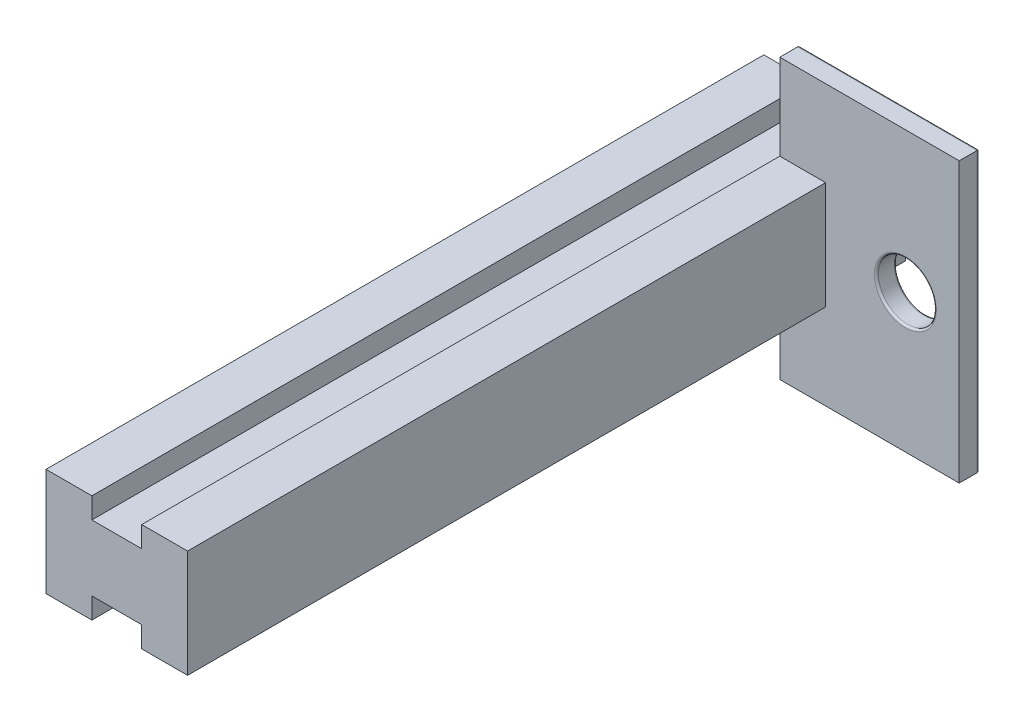
ISO-10303-21;
HEADER;
FILE_DESCRIPTION(('STEP AP214'),'2;1');
FILE_NAME('part.step','',(''),(''),'','','');
FILE_SCHEMA(('AUTOMOTIVE_DESIGN { 1 0 10303 214 1 1 1 1 }'));
ENDSEC;
DATA;
#1=APPLICATION_CONTEXT('core data for automotive mechanical design processes');
#2=APPLICATION_PROTOCOL_DEFINITION('international standard','automotive_design',2000,#1);
#3=PRODUCT_CONTEXT('',#1,'mechanical');
#4=PRODUCT('Part','Part','',(#3));
#5=PRODUCT_RELATED_PRODUCT_CATEGORY('part','',(#4));
#6=PRODUCT_DEFINITION_FORMATION('','',#4);
#7=PRODUCT_DEFINITION_CONTEXT('part definition',#1,'design');
#8=PRODUCT_DEFINITION('design','',#6,#7);
#9=PRODUCT_DEFINITION_SHAPE('','',#8);
#10=(LENGTH_UNIT() NAMED_UNIT(*) SI_UNIT(.MILLI.,.METRE.));
#11=(NAMED_UNIT(*) PLANE_ANGLE_UNIT() SI_UNIT($,.RADIAN.));
#12=(NAMED_UNIT(*) SI_UNIT($,.STERADIAN.) SOLID_ANGLE_UNIT());
#13=UNCERTAINTY_MEASURE_WITH_UNIT(LENGTH_MEASURE(1.E-05),#10,'distance_accuracy_value','');
#14=(GEOMETRIC_REPRESENTATION_CONTEXT(3) GLOBAL_UNCERTAINTY_ASSIGNED_CONTEXT((#13)) GLOBAL_UNIT_ASSIGNED_CONTEXT((#10,
#11,#12)) REPRESENTATION_CONTEXT('',''));
#15=CARTESIAN_POINT('',(0.,0.,0.));
#16=DIRECTION('',(0.,0.,1.));
#17=DIRECTION('',(1.,0.,0.));
#18=AXIS2_PLACEMENT_3D('',#15,#16,#17);
#19=CARTESIAN_POINT('',(1.19999999999997,-2.65,60.));
#20=DIRECTION('',(0.,1.,0.));
#21=DIRECTION('',(0.,0.,1.));
#22=AXIS2_PLACEMENT_3D('',#19,#20,#21);
#23=PLANE('',#22);
#24=DIRECTION('',(-1.,0.,0.));
#25=VECTOR('',#24,1.);
#26=CARTESIAN_POINT('',(1.19999999999997,-2.65,2.90000000000001));
#27=LINE('',#26,#25);
#28=CARTESIAN_POINT('',(3.49999999999996,-2.65,2.90000000000003));
#29=VERTEX_POINT('',#28);
#30=CARTESIAN_POINT('',(1.29999999999997,-2.65,2.90000000000001));
#31=VERTEX_POINT('',#30);
#32=EDGE_CURVE('E263',#29,#31,#27,.T.);
#33=ORIENTED_EDGE('',*,*,#32,.T.);
#34=DIRECTION('',(0.,0.,-1.));
#35=VECTOR('',#34,1.);
#36=CARTESIAN_POINT('',(1.29999999999997,-2.65,60.));
#37=LINE('',#36,#35);
#38=CARTESIAN_POINT('',(1.29999999999997,-2.65,0.));
#39=VERTEX_POINT('',#38);
#40=EDGE_CURVE('E266',#31,#39,#37,.T.);
#41=ORIENTED_EDGE('',*,*,#40,.T.);
#42=DIRECTION('',(1.,0.,0.));
#43=VECTOR('',#42,1.);
#44=CARTESIAN_POINT('',(1.19999999999997,-2.65,0.));
#45=LINE('',#44,#43);
#46=CARTESIAN_POINT('',(3.49999999999996,-2.65,0.));
#47=VERTEX_POINT('',#46);
#48=EDGE_CURVE('E461',#39,#47,#45,.T.);
#49=ORIENTED_EDGE('',*,*,#48,.T.);
#50=DIRECTION('',(0.,0.,-1.));
#51=VECTOR('',#50,1.);
#52=CARTESIAN_POINT('',(3.49999999999996,-2.65,60.));
#53=LINE('',#52,#51);
#54=EDGE_CURVE('E244',#29,#47,#53,.T.);
#55=ORIENTED_EDGE('',*,*,#54,.F.);
#56=EDGE_LOOP('',(#33,#41,#49,#55));
#57=FACE_BOUND('',#56,.T.);
#58=ADVANCED_FACE('F39',(#57),#23,.F.);
#59=CARTESIAN_POINT('',(3.49999999999996,2.75,60.));
#60=DIRECTION('',(1.,0.,0.));
#61=DIRECTION('',(0.,1.,0.));
#62=AXIS2_PLACEMENT_3D('',#59,#60,#61);
#63=PLANE('',#62);
#64=DIRECTION('',(0.,0.,-1.));
#65=VECTOR('',#64,1.);
#66=CARTESIAN_POINT('',(3.49999999999996,2.75,60.));
#67=LINE('',#66,#65);
#68=CARTESIAN_POINT('',(3.49999999999996,2.75,2.90000000000003));
#69=VERTEX_POINT('',#68);
#70=CARTESIAN_POINT('',(3.49999999999996,2.75,0.));
#71=VERTEX_POINT('',#70);
#72=EDGE_CURVE('E245',#69,#71,#67,.T.);
#73=ORIENTED_EDGE('',*,*,#72,.F.);
#74=DIRECTION('',(0.,1.,0.));
#75=VECTOR('',#74,1.);
#76=CARTESIAN_POINT('',(3.49999999999996,2.75000000000001,2.90000000000003));
#77=LINE('',#76,#75);
#78=EDGE_CURVE('E332',#69,#29,#77,.F.);
#79=ORIENTED_EDGE('',*,*,#78,.T.);
#80=ORIENTED_EDGE('',*,*,#54,.T.);
#81=DIRECTION('',(0.,-1.,0.));
#82=VECTOR('',#81,1.);
#83=CARTESIAN_POINT('',(3.49999999999996,2.75,0.));
#84=LINE('',#83,#82);
#85=EDGE_CURVE('E457',#71,#47,#84,.T.);
#86=ORIENTED_EDGE('',*,*,#85,.F.);
#87=EDGE_LOOP('',(#73,#79,#80,#86));
#88=FACE_BOUND('',#87,.T.);
#89=ADVANCED_FACE('F592',(#88),#63,.T.);
#90=CARTESIAN_POINT('',(1.19999999999997,2.75,60.));
#91=DIRECTION('',(0.,1.,0.));
#92=DIRECTION('',(-1.,0.,0.));
#93=AXIS2_PLACEMENT_3D('',#90,#91,#92);
#94=PLANE('',#93);
#95=DIRECTION('',(1.,0.,0.));
#96=VECTOR('',#95,1.);
#97=CARTESIAN_POINT('',(1.19999999999997,2.75,0.));
#98=LINE('',#97,#96);
#99=CARTESIAN_POINT('',(1.29999999999997,2.75,0.));
#100=VERTEX_POINT('',#99);
#101=EDGE_CURVE('E453',#100,#71,#98,.T.);
#102=ORIENTED_EDGE('',*,*,#101,.F.);
#103=DIRECTION('',(0.,0.,-1.));
#104=VECTOR('',#103,1.);
#105=CARTESIAN_POINT('',(1.29999999999997,2.75,3.));
#106=LINE('',#105,#104);
#107=CARTESIAN_POINT('',(1.29999999999997,2.75,2.9));
#108=VERTEX_POINT('',#107);
#109=EDGE_CURVE('E300',#100,#108,#106,.F.);
#110=ORIENTED_EDGE('',*,*,#109,.T.);
#111=DIRECTION('',(-1.,0.,0.));
#112=VECTOR('',#111,1.);
#113=CARTESIAN_POINT('',(1.20000000000073,2.75,2.90000000000001));
#114=LINE('',#113,#112);
#115=EDGE_CURVE('E297',#108,#69,#114,.F.);
#116=ORIENTED_EDGE('',*,*,#115,.T.);
#117=ORIENTED_EDGE('',*,*,#72,.T.);
#118=EDGE_LOOP('',(#102,#110,#116,#117));
#119=FACE_BOUND('',#118,.T.);
#120=ADVANCED_FACE('F587',(#119),#94,.T.);
#121=CARTESIAN_POINT('',(-1.30000000000003,2.75,60.));
#122=DIRECTION('',(1.,0.,0.));
#123=DIRECTION('',(0.,0.,-1.));
#124=AXIS2_PLACEMENT_3D('',#121,#122,#123);
#125=PLANE('',#124);
#126=DIRECTION('',(0.,1.,0.));
#127=VECTOR('',#126,1.);
#128=CARTESIAN_POINT('',(-1.30000000000003,2.75,36.));
#129=LINE('',#128,#127);
#130=CARTESIAN_POINT('',(-1.30000000000002,1.70000000000001,36.));
#131=VERTEX_POINT('',#130);
#132=CARTESIAN_POINT('',(-1.30000000000003,2.75,36.));
#133=VERTEX_POINT('',#132);
#134=EDGE_CURVE('E522',#131,#133,#129,.T.);
#135=ORIENTED_EDGE('',*,*,#134,.F.);
#136=DIRECTION('',(0.,0.,-1.));
#137=VECTOR('',#136,1.);
#138=CARTESIAN_POINT('',(-1.30000000000003,1.70000000000001,60.));
#139=LINE('',#138,#137);
#140=CARTESIAN_POINT('',(-1.30000000000003,1.70000000000001,0.));
#141=VERTEX_POINT('',#140);
#142=EDGE_CURVE('E259',#131,#141,#139,.T.);
#143=ORIENTED_EDGE('',*,*,#142,.T.);
#144=DIRECTION('',(0.,-1.,0.));
#145=VECTOR('',#144,1.);
#146=CARTESIAN_POINT('',(-1.30000000000003,2.75,0.));
#147=LINE('',#146,#145);
#148=CARTESIAN_POINT('',(-1.30000000000003,2.75,0.));
#149=VERTEX_POINT('',#148);
#150=EDGE_CURVE('E441',#149,#141,#147,.T.);
#151=ORIENTED_EDGE('',*,*,#150,.F.);
#152=DIRECTION('',(0.,0.,-1.));
#153=VECTOR('',#152,1.);
#154=CARTESIAN_POINT('',(-1.30000000000003,2.75,60.));
#155=LINE('',#154,#153);
#156=EDGE_CURVE('E267',#133,#149,#155,.T.);
#157=ORIENTED_EDGE('',*,*,#156,.F.);
#158=EDGE_LOOP('',(#135,#143,#151,#157));
#159=FACE_BOUND('',#158,.T.);
#160=ADVANCED_FACE('F612',(#159),#125,.T.);
#161=CARTESIAN_POINT('',(-1.30000000000003,2.75,60.));
#162=DIRECTION('',(0.,-1.,0.));
#163=DIRECTION('',(1.,0.,0.));
#164=AXIS2_PLACEMENT_3D('',#161,#162,#163);
#165=PLANE('',#164);
#166=DIRECTION('',(0.,0.,-1.));
#167=VECTOR('',#166,1.);
#168=CARTESIAN_POINT('',(-3.60000000000001,2.75,60.));
#169=LINE('',#168,#167);
#170=CARTESIAN_POINT('',(-3.60000000000001,2.75,36.));
#171=VERTEX_POINT('',#170);
#172=CARTESIAN_POINT('',(-3.60000000000001,2.75,0.));
#173=VERTEX_POINT('',#172);
#174=EDGE_CURVE('E489',#171,#173,#169,.T.);
#175=ORIENTED_EDGE('',*,*,#174,.F.);
#176=DIRECTION('',(-1.,0.,0.));
#177=VECTOR('',#176,1.);
#178=CARTESIAN_POINT('',(3.49999999999996,2.75,36.));
#179=LINE('',#178,#177);
#180=EDGE_CURVE('E227',#133,#171,#179,.T.);
#181=ORIENTED_EDGE('',*,*,#180,.F.);
#182=ORIENTED_EDGE('',*,*,#156,.T.);
#183=DIRECTION('',(-1.,0.,0.));
#184=VECTOR('',#183,1.);
#185=CARTESIAN_POINT('',(-1.30000000000003,2.75,0.));
#186=LINE('',#185,#184);
#187=EDGE_CURVE('E262',#149,#173,#186,.T.);
#188=ORIENTED_EDGE('',*,*,#187,.T.);
#189=EDGE_LOOP('',(#175,#181,#182,#188));
#190=FACE_BOUND('',#189,.T.);
#191=ADVANCED_FACE('F615',(#190),#165,.F.);
#192=CARTESIAN_POINT('',(-3.60000000000001,2.75,60.));
#193=DIRECTION('',(1.,0.,0.));
#194=DIRECTION('',(0.,0.,-1.));
#195=AXIS2_PLACEMENT_3D('',#192,#193,#194);
#196=PLANE('',#195);
#197=DIRECTION('',(0.,0.,-1.));
#198=VECTOR('',#197,1.);
#199=CARTESIAN_POINT('',(-3.60000000000001,-2.65,60.));
#200=LINE('',#199,#198);
#201=CARTESIAN_POINT('',(-3.60000000000001,-2.65,36.));
#202=VERTEX_POINT('',#201);
#203=CARTESIAN_POINT('',(-3.60000000000001,-2.65,0.));
#204=VERTEX_POINT('',#203);
#205=EDGE_CURVE('E492',#202,#204,#200,.T.);
#206=ORIENTED_EDGE('',*,*,#205,.F.);
#207=DIRECTION('',(0.,-1.,0.));
#208=VECTOR('',#207,1.);
#209=CARTESIAN_POINT('',(-3.60000000000001,2.75,36.));
#210=LINE('',#209,#208);
#211=EDGE_CURVE('E237',#171,#202,#210,.T.);
#212=ORIENTED_EDGE('',*,*,#211,.F.);
#213=ORIENTED_EDGE('',*,*,#174,.T.);
#214=DIRECTION('',(0.,-1.,0.));
#215=VECTOR('',#214,1.);
#216=CARTESIAN_POINT('',(-3.60000000000001,2.75,0.));
#217=LINE('',#216,#215);
#218=EDGE_CURVE('E480',#173,#204,#217,.T.);
#219=ORIENTED_EDGE('',*,*,#218,.T.);
#220=EDGE_LOOP('',(#206,#212,#213,#219));
#221=FACE_BOUND('',#220,.T.);
#222=ADVANCED_FACE('F620',(#221),#196,.F.);
#223=CARTESIAN_POINT('',(-1.30000000000003,-2.65,60.));
#224=DIRECTION('',(0.,-1.,0.));
#225=DIRECTION('',(1.,0.,0.));
#226=AXIS2_PLACEMENT_3D('',#223,#224,#225);
#227=PLANE('',#226);
#228=DIRECTION('',(1.,0.,0.));
#229=VECTOR('',#228,1.);
#230=CARTESIAN_POINT('',(3.49999999999996,-2.65,36.));
#231=LINE('',#230,#229);
#232=CARTESIAN_POINT('',(-1.30000000000002,-2.65,36.));
#233=VERTEX_POINT('',#232);
#234=EDGE_CURVE('E523',#202,#233,#231,.T.);
#235=ORIENTED_EDGE('',*,*,#234,.F.);
#236=ORIENTED_EDGE('',*,*,#205,.T.);
#237=DIRECTION('',(-1.,0.,0.));
#238=VECTOR('',#237,1.);
#239=CARTESIAN_POINT('',(-1.30000000000003,-2.65,0.));
#240=LINE('',#239,#238);
#241=CARTESIAN_POINT('',(-1.30000000000003,-2.65,0.));
#242=VERTEX_POINT('',#241);
#243=EDGE_CURVE('E476',#242,#204,#240,.T.);
#244=ORIENTED_EDGE('',*,*,#243,.F.);
#245=DIRECTION('',(0.,0.,-1.));
#246=VECTOR('',#245,1.);
#247=CARTESIAN_POINT('',(-1.30000000000003,-2.65,60.));
#248=LINE('',#247,#246);
#249=EDGE_CURVE('E495',#233,#242,#248,.T.);
#250=ORIENTED_EDGE('',*,*,#249,.F.);
#251=EDGE_LOOP('',(#235,#236,#244,#250));
#252=FACE_BOUND('',#251,.T.);
#253=ADVANCED_FACE('F629',(#252),#227,.T.);
#254=CARTESIAN_POINT('',(-1.30000000000003,-1.6,60.));
#255=DIRECTION('',(1.,0.,0.));
#256=DIRECTION('',(0.,1.,0.));
#257=AXIS2_PLACEMENT_3D('',#254,#255,#256);
#258=PLANE('',#257);
#259=DIRECTION('',(0.,1.,0.));
#260=VECTOR('',#259,1.);
#261=CARTESIAN_POINT('',(-1.30000000000003,-1.6,36.));
#262=LINE('',#261,#260);
#263=CARTESIAN_POINT('',(-1.30000000000003,-1.6,36.));
#264=VERTEX_POINT('',#263);
#265=EDGE_CURVE('E359',#233,#264,#262,.T.);
#266=ORIENTED_EDGE('',*,*,#265,.F.);
#267=ORIENTED_EDGE('',*,*,#249,.T.);
#268=DIRECTION('',(0.,-1.,0.));
#269=VECTOR('',#268,1.);
#270=CARTESIAN_POINT('',(-1.30000000000003,-1.6,0.));
#271=LINE('',#270,#269);
#272=CARTESIAN_POINT('',(-1.30000000000003,-1.6,0.));
#273=VERTEX_POINT('',#272);
#274=EDGE_CURVE('E472',#273,#242,#271,.T.);
#275=ORIENTED_EDGE('',*,*,#274,.F.);
#276=DIRECTION('',(0.,0.,-1.));
#277=VECTOR('',#276,1.);
#278=CARTESIAN_POINT('',(-1.30000000000003,-1.6,60.));
#279=LINE('',#278,#277);
#280=EDGE_CURVE('E498',#264,#273,#279,.T.);
#281=ORIENTED_EDGE('',*,*,#280,.F.);
#282=EDGE_LOOP('',(#266,#267,#275,#281));
#283=FACE_BOUND('',#282,.T.);
#284=ADVANCED_FACE('F632',(#283),#258,.T.);
#285=CARTESIAN_POINT('',(1.19999999999997,-1.60000000000001,60.));
#286=DIRECTION('',(0.,-1.,0.));
#287=DIRECTION('',(1.,0.,0.));
#288=AXIS2_PLACEMENT_3D('',#285,#286,#287);
#289=PLANE('',#288);
#290=DIRECTION('',(1.,0.,0.));
#291=VECTOR('',#290,1.);
#292=CARTESIAN_POINT('',(1.19999999999997,-1.60000000000001,36.));
#293=LINE('',#292,#291);
#294=CARTESIAN_POINT('',(1.19999999999997,-1.60000000000001,36.));
#295=VERTEX_POINT('',#294);
#296=EDGE_CURVE('E535',#264,#295,#293,.T.);
#297=ORIENTED_EDGE('',*,*,#296,.F.);
#298=ORIENTED_EDGE('',*,*,#280,.T.);
#299=DIRECTION('',(-1.,0.,0.));
#300=VECTOR('',#299,1.);
#301=CARTESIAN_POINT('',(1.19999999999997,-1.60000000000001,0.));
#302=LINE('',#301,#300);
#303=CARTESIAN_POINT('',(1.19999999999997,-1.60000000000001,0.));
#304=VERTEX_POINT('',#303);
#305=EDGE_CURVE('E468',#304,#273,#302,.T.);
#306=ORIENTED_EDGE('',*,*,#305,.F.);
#307=DIRECTION('',(0.,0.,-1.));
#308=VECTOR('',#307,1.);
#309=CARTESIAN_POINT('',(1.19999999999997,-1.60000000000001,60.));
#310=LINE('',#309,#308);
#311=EDGE_CURVE('E501',#295,#304,#310,.T.);
#312=ORIENTED_EDGE('',*,*,#311,.F.);
#313=EDGE_LOOP('',(#297,#298,#306,#312));
#314=FACE_BOUND('',#313,.T.);
#315=ADVANCED_FACE('F637',(#314),#289,.T.);
#316=CARTESIAN_POINT('',(1.19999999999997,-1.60000000000001,60.));
#317=DIRECTION('',(1.,0.,0.));
#318=DIRECTION('',(0.,0.,-1.));
#319=AXIS2_PLACEMENT_3D('',#316,#317,#318);
#320=PLANE('',#319);
#321=DIRECTION('',(0.,0.,-1.));
#322=VECTOR('',#321,1.);
#323=CARTESIAN_POINT('',(1.19999999999997,-2.65,60.));
#324=LINE('',#323,#322);
#325=CARTESIAN_POINT('',(1.19999999999996,-2.65,36.));
#326=VERTEX_POINT('',#325);
#327=CARTESIAN_POINT('',(1.19999999999996,-2.65,4.));
#328=VERTEX_POINT('',#327);
#329=EDGE_CURVE('E503',#326,#328,#324,.T.);
#330=ORIENTED_EDGE('',*,*,#329,.F.);
#331=DIRECTION('',(0.,1.,0.));
#332=VECTOR('',#331,1.);
#333=CARTESIAN_POINT('',(1.19999999999997,-1.60000000000001,36.));
#334=LINE('',#333,#332);
#335=EDGE_CURVE('E527',#326,#295,#334,.T.);
#336=ORIENTED_EDGE('',*,*,#335,.T.);
#337=ORIENTED_EDGE('',*,*,#311,.T.);
#338=DIRECTION('',(0.,-1.,0.));
#339=VECTOR('',#338,1.);
#340=CARTESIAN_POINT('',(1.19999999999997,-1.60000000000001,0.));
#341=LINE('',#340,#339);
#342=CARTESIAN_POINT('',(1.19999999999997,-2.55,0.));
#343=VERTEX_POINT('',#342);
#344=EDGE_CURVE('E464',#304,#343,#341,.T.);
#345=ORIENTED_EDGE('',*,*,#344,.T.);
#346=DIRECTION('',(0.,0.,-1.));
#347=VECTOR('',#346,1.);
#348=CARTESIAN_POINT('',(1.19999999999997,-2.55,60.));
#349=LINE('',#348,#347);
#350=CARTESIAN_POINT('',(1.19999999999997,-2.55,2.90000000000001));
#351=VERTEX_POINT('',#350);
#352=EDGE_CURVE('E284',#343,#351,#349,.F.);
#353=ORIENTED_EDGE('',*,*,#352,.T.);
#354=CARTESIAN_POINT('',(1.19999999999997,-2.75,2.90000000000001));
#355=DIRECTION('',(1.,0.,0.));
#356=DIRECTION('',(0.,0.,-1.));
#357=AXIS2_PLACEMENT_3D('',#354,#355,#356);
#358=CIRCLE('',#357,0.2);
#359=CARTESIAN_POINT('',(1.19999999999997,-2.75,3.1));
#360=VERTEX_POINT('',#359);
#361=EDGE_CURVE('E280',#360,#351,#358,.F.);
#362=ORIENTED_EDGE('',*,*,#361,.F.);
#363=DIRECTION('',(0.,1.,0.));
#364=VECTOR('',#363,1.);
#365=CARTESIAN_POINT('',(1.19999999999997,-1.6,3.10000000000001));
#366=LINE('',#365,#364);
#367=CARTESIAN_POINT('',(1.19999999999997,-6.95,3.1));
#368=VERTEX_POINT('',#367);
#369=EDGE_CURVE('E277',#360,#368,#366,.F.);
#370=ORIENTED_EDGE('',*,*,#369,.T.);
#371=DIRECTION('',(0.,0.,-1.));
#372=VECTOR('',#371,1.);
#373=CARTESIAN_POINT('',(1.19999999999997,-6.95,3.));
#374=LINE('',#373,#372);
#375=CARTESIAN_POINT('',(1.19999999999996,-6.94999999999999,4.));
#376=VERTEX_POINT('',#375);
#377=EDGE_CURVE('E400',#376,#368,#374,.T.);
#378=ORIENTED_EDGE('',*,*,#377,.F.);
#379=DIRECTION('',(0.,-1.,0.));
#380=VECTOR('',#379,1.);
#381=CARTESIAN_POINT('',(1.19999999999996,-6.94999999999999,4.));
#382=LINE('',#381,#380);
#383=EDGE_CURVE('E414',#328,#376,#382,.T.);
#384=ORIENTED_EDGE('',*,*,#383,.F.);
#385=EDGE_LOOP('',(#330,#336,#337,#345,#353,#362,#370,#378,#384));
#386=FACE_BOUND('',#385,.T.);
#387=ADVANCED_FACE('F641',(#386),#320,.F.);
#388=CARTESIAN_POINT('',(3.49999999999996,-2.65,36.));
#389=VERTEX_POINT('',#388);
#390=CARTESIAN_POINT('',(3.49999999999996,-2.65,4.));
#391=VERTEX_POINT('',#390);
#392=EDGE_CURVE('E250',#389,#391,#53,.T.);
#393=ORIENTED_EDGE('',*,*,#392,.F.);
#394=EDGE_CURVE('E222',#326,#389,#231,.T.);
#395=ORIENTED_EDGE('',*,*,#394,.F.);
#396=ORIENTED_EDGE('',*,*,#329,.T.);
#397=DIRECTION('',(1.,0.,0.));
#398=VECTOR('',#397,1.);
#399=CARTESIAN_POINT('',(1.19999999999997,-2.65,4.));
#400=LINE('',#399,#398);
#401=EDGE_CURVE('E437',#328,#391,#400,.T.);
#402=ORIENTED_EDGE('',*,*,#401,.T.);
#403=EDGE_LOOP('',(#393,#395,#396,#402));
#404=FACE_BOUND('',#403,.T.);
#405=ADVANCED_FACE('F509',(#404),#23,.F.);
#406=DIRECTION('',(0.,1.,0.));
#407=VECTOR('',#406,1.);
#408=CARTESIAN_POINT('',(3.49999999999996,2.75,36.));
#409=LINE('',#408,#407);
#410=CARTESIAN_POINT('',(3.49999999999996,2.75,36.));
#411=VERTEX_POINT('',#410);
#412=EDGE_CURVE('E217',#389,#411,#409,.T.);
#413=ORIENTED_EDGE('',*,*,#412,.F.);
#414=ORIENTED_EDGE('',*,*,#392,.T.);
#415=DIRECTION('',(0.,1.,0.));
#416=VECTOR('',#415,1.);
#417=CARTESIAN_POINT('',(3.49999999999996,-7.25,4.));
#418=LINE('',#417,#416);
#419=CARTESIAN_POINT('',(3.49999999999996,2.75,4.));
#420=VERTEX_POINT('',#419);
#421=EDGE_CURVE('E241',#391,#420,#418,.T.);
#422=ORIENTED_EDGE('',*,*,#421,.T.);
#423=EDGE_CURVE('E233',#411,#420,#67,.T.);
#424=ORIENTED_EDGE('',*,*,#423,.F.);
#425=EDGE_LOOP('',(#413,#414,#422,#424));
#426=FACE_BOUND('',#425,.T.);
#427=ADVANCED_FACE('F239',(#426),#63,.T.);
#428=CARTESIAN_POINT('',(1.19999999999997,2.75,36.));
#429=VERTEX_POINT('',#428);
#430=EDGE_CURVE('E220',#411,#429,#179,.T.);
#431=ORIENTED_EDGE('',*,*,#430,.F.);
#432=ORIENTED_EDGE('',*,*,#423,.T.);
#433=DIRECTION('',(1.,0.,0.));
#434=VECTOR('',#433,1.);
#435=CARTESIAN_POINT('',(3.49999999999996,2.75,4.));
#436=LINE('',#435,#434);
#437=CARTESIAN_POINT('',(1.19999999999996,2.75,4.));
#438=VERTEX_POINT('',#437);
#439=EDGE_CURVE('E432',#438,#420,#436,.T.);
#440=ORIENTED_EDGE('',*,*,#439,.F.);
#441=DIRECTION('',(0.,0.,-1.));
#442=VECTOR('',#441,1.);
#443=CARTESIAN_POINT('',(1.19999999999997,2.75,60.));
#444=LINE('',#443,#442);
#445=EDGE_CURVE('E235',#429,#438,#444,.T.);
#446=ORIENTED_EDGE('',*,*,#445,.F.);
#447=EDGE_LOOP('',(#431,#432,#440,#446));
#448=FACE_BOUND('',#447,.T.);
#449=ADVANCED_FACE('F231',(#448),#94,.T.);
#450=CARTESIAN_POINT('',(1.19999999999997,2.75,60.));
#451=DIRECTION('',(1.,0.,0.));
#452=DIRECTION('',(0.,1.,0.));
#453=AXIS2_PLACEMENT_3D('',#450,#451,#452);
#454=PLANE('',#453);
#455=DIRECTION('',(0.,0.,-1.));
#456=VECTOR('',#455,1.);
#457=CARTESIAN_POINT('',(1.19999999999997,1.70000000000001,60.));
#458=LINE('',#457,#456);
#459=CARTESIAN_POINT('',(1.19999999999997,1.70000000000001,36.));
#460=VERTEX_POINT('',#459);
#461=CARTESIAN_POINT('',(1.19999999999997,1.70000000000001,0.));
#462=VERTEX_POINT('',#461);
#463=EDGE_CURVE('E256',#460,#462,#458,.T.);
#464=ORIENTED_EDGE('',*,*,#463,.F.);
#465=DIRECTION('',(0.,1.,0.));
#466=VECTOR('',#465,1.);
#467=CARTESIAN_POINT('',(1.19999999999997,2.75,36.));
#468=LINE('',#467,#466);
#469=EDGE_CURVE('E55',#460,#429,#468,.T.);
#470=ORIENTED_EDGE('',*,*,#469,.T.);
#471=ORIENTED_EDGE('',*,*,#445,.T.);
#472=CARTESIAN_POINT('',(1.19999999999996,7.05,4.));
#473=VERTEX_POINT('',#472);
#474=EDGE_CURVE('E420',#473,#438,#382,.T.);
#475=ORIENTED_EDGE('',*,*,#474,.F.);
#476=DIRECTION('',(0.,0.,1.));
#477=VECTOR('',#476,1.);
#478=CARTESIAN_POINT('',(1.19999999999996,7.05,4.));
#479=LINE('',#478,#477);
#480=CARTESIAN_POINT('',(1.19999999999997,7.05,3.1));
#481=VERTEX_POINT('',#480);
#482=EDGE_CURVE('E407',#481,#473,#479,.T.);
#483=ORIENTED_EDGE('',*,*,#482,.F.);
#484=DIRECTION('',(0.,1.,0.));
#485=VECTOR('',#484,1.);
#486=CARTESIAN_POINT('',(1.19999999999997,2.75000000000001,3.10000000000001));
#487=LINE('',#486,#485);
#488=CARTESIAN_POINT('',(1.19999999999997,2.85,3.1));
#489=VERTEX_POINT('',#488);
#490=EDGE_CURVE('E291',#481,#489,#487,.F.);
#491=ORIENTED_EDGE('',*,*,#490,.T.);
#492=CARTESIAN_POINT('',(1.19999999999997,2.85,2.9));
#493=DIRECTION('',(1.,0.,0.));
#494=DIRECTION('',(0.,1.,0.));
#495=AXIS2_PLACEMENT_3D('',#492,#493,#494);
#496=CIRCLE('',#495,0.2);
#497=CARTESIAN_POINT('',(1.19999999999997,2.65,2.9));
#498=VERTEX_POINT('',#497);
#499=EDGE_CURVE('E287',#498,#489,#496,.F.);
#500=ORIENTED_EDGE('',*,*,#499,.F.);
#501=DIRECTION('',(0.,0.,-1.));
#502=VECTOR('',#501,1.);
#503=CARTESIAN_POINT('',(1.19999999999997,2.65,0.));
#504=LINE('',#503,#502);
#505=CARTESIAN_POINT('',(1.19999999999997,2.65,0.));
#506=VERTEX_POINT('',#505);
#507=EDGE_CURVE('E294',#498,#506,#504,.T.);
#508=ORIENTED_EDGE('',*,*,#507,.T.);
#509=DIRECTION('',(0.,-1.,0.));
#510=VECTOR('',#509,1.);
#511=CARTESIAN_POINT('',(1.19999999999997,2.75,0.));
#512=LINE('',#511,#510);
#513=EDGE_CURVE('E449',#506,#462,#512,.T.);
#514=ORIENTED_EDGE('',*,*,#513,.T.);
#515=EDGE_LOOP('',(#464,#470,#471,#475,#483,#491,#500,#508,#514));
#516=FACE_BOUND('',#515,.T.);
#517=ADVANCED_FACE('F519',(#516),#454,.F.);
#518=CARTESIAN_POINT('',(1.19999999999997,1.70000000000001,60.));
#519=DIRECTION('',(0.,-1.,0.));
#520=DIRECTION('',(1.,0.,0.));
#521=AXIS2_PLACEMENT_3D('',#518,#519,#520);
#522=PLANE('',#521);
#523=ORIENTED_EDGE('',*,*,#142,.F.);
#524=DIRECTION('',(1.,0.,0.));
#525=VECTOR('',#524,1.);
#526=CARTESIAN_POINT('',(1.19999999999997,1.70000000000001,36.));
#527=LINE('',#526,#525);
#528=EDGE_CURVE('E11',#131,#460,#527,.T.);
#529=ORIENTED_EDGE('',*,*,#528,.T.);
#530=ORIENTED_EDGE('',*,*,#463,.T.);
#531=DIRECTION('',(-1.,0.,0.));
#532=VECTOR('',#531,1.);
#533=CARTESIAN_POINT('',(1.19999999999997,1.70000000000001,0.));
#534=LINE('',#533,#532);
#535=EDGE_CURVE('E445',#462,#141,#534,.T.);
#536=ORIENTED_EDGE('',*,*,#535,.T.);
#537=EDGE_LOOP('',(#523,#529,#530,#536));
#538=FACE_BOUND('',#537,.T.);
#539=ADVANCED_FACE('F607',(#538),#522,.F.);
#540=CARTESIAN_POINT('',(0.,0.,0.));
#541=DIRECTION('',(0.,0.,-1.));
#542=DIRECTION('',(-1.,0.,0.));
#543=AXIS2_PLACEMENT_3D('',#540,#541,#542);
#544=PLANE('',#543);
#545=ORIENTED_EDGE('',*,*,#48,.F.);
#546=CARTESIAN_POINT('',(1.29999999999997,-2.55,0.));
#547=DIRECTION('',(0.,0.,-1.));
#548=DIRECTION('',(-1.,0.,0.));
#549=AXIS2_PLACEMENT_3D('',#546,#547,#548);
#550=CIRCLE('',#549,0.1);
#551=EDGE_CURVE('E274',#39,#343,#550,.T.);
#552=ORIENTED_EDGE('',*,*,#551,.T.);
#553=ORIENTED_EDGE('',*,*,#344,.F.);
#554=ORIENTED_EDGE('',*,*,#305,.T.);
#555=ORIENTED_EDGE('',*,*,#274,.T.);
#556=ORIENTED_EDGE('',*,*,#243,.T.);
#557=ORIENTED_EDGE('',*,*,#218,.F.);
#558=ORIENTED_EDGE('',*,*,#187,.F.);
#559=ORIENTED_EDGE('',*,*,#150,.T.);
#560=ORIENTED_EDGE('',*,*,#535,.F.);
#561=ORIENTED_EDGE('',*,*,#513,.F.);
#562=CARTESIAN_POINT('',(1.29999999999997,2.65,0.));
#563=DIRECTION('',(0.,0.,-1.));
#564=DIRECTION('',(-1.,0.,0.));
#565=AXIS2_PLACEMENT_3D('',#562,#563,#564);
#566=CIRCLE('',#565,0.1);
#567=EDGE_CURVE('E271',#506,#100,#566,.T.);
#568=ORIENTED_EDGE('',*,*,#567,.T.);
#569=ORIENTED_EDGE('',*,*,#101,.T.);
#570=ORIENTED_EDGE('',*,*,#85,.T.);
#571=EDGE_LOOP('',(#545,#552,#553,#554,#555,#556,#557,#558,#559,#560,#561,#568,#569,#570));
#572=FACE_BOUND('',#571,.T.);
#573=ADVANCED_FACE('F596',(#572),#544,.T.);
#574=CARTESIAN_POINT('',(10.2,7.05,3.00000000000012));
#575=DIRECTION('',(0.,0.,1.));
#576=DIRECTION('',(1.,0.,0.));
#577=AXIS2_PLACEMENT_3D('',#574,#575,#576);
#578=PLANE('',#577);
#579=DIRECTION('',(0.,1.,0.));
#580=VECTOR('',#579,1.);
#581=CARTESIAN_POINT('',(1.29999999999998,7.05,3.));
#582=LINE('',#581,#580);
#583=CARTESIAN_POINT('',(1.29999999999998,-6.85,3.));
#584=VERTEX_POINT('',#583);
#585=CARTESIAN_POINT('',(1.29999999999998,-2.75,3.));
#586=VERTEX_POINT('',#585);
#587=EDGE_CURVE('E326',#584,#586,#582,.T.);
#588=ORIENTED_EDGE('',*,*,#587,.T.);
#589=DIRECTION('',(-1.,0.,0.));
#590=VECTOR('',#589,1.);
#591=CARTESIAN_POINT('',(3.49999999999996,-2.75,3.00000000000003));
#592=LINE('',#591,#590);
#593=CARTESIAN_POINT('',(3.59999999999996,-2.75,3.00000000000003));
#594=VERTEX_POINT('',#593);
#595=EDGE_CURVE('E329',#586,#594,#592,.F.);
#596=ORIENTED_EDGE('',*,*,#595,.T.);
#597=DIRECTION('',(0.,1.,0.));
#598=VECTOR('',#597,1.);
#599=CARTESIAN_POINT('',(3.59999999999996,7.05,3.00000000000003));
#600=LINE('',#599,#598);
#601=CARTESIAN_POINT('',(3.59999999999996,2.85,3.00000000000003));
#602=VERTEX_POINT('',#601);
#603=EDGE_CURVE('E322',#594,#602,#600,.T.);
#604=ORIENTED_EDGE('',*,*,#603,.T.);
#605=DIRECTION('',(-1.,0.,0.));
#606=VECTOR('',#605,1.);
#607=CARTESIAN_POINT('',(10.2,2.85,3.00000000000012));
#608=LINE('',#607,#606);
#609=CARTESIAN_POINT('',(1.29999999999997,2.85,3.));
#610=VERTEX_POINT('',#609);
#611=EDGE_CURVE('E316',#602,#610,#608,.T.);
#612=ORIENTED_EDGE('',*,*,#611,.T.);
#613=DIRECTION('',(0.,1.,0.));
#614=VECTOR('',#613,1.);
#615=CARTESIAN_POINT('',(1.29999999999997,7.05,3.));
#616=LINE('',#615,#614);
#617=CARTESIAN_POINT('',(1.29999999999997,6.95,3.));
#618=VERTEX_POINT('',#617);
#619=EDGE_CURVE('E313',#610,#618,#616,.T.);
#620=ORIENTED_EDGE('',*,*,#619,.T.);
#621=DIRECTION('',(-1.,0.,0.));
#622=VECTOR('',#621,1.);
#623=CARTESIAN_POINT('',(10.2,6.95,3.00000000000012));
#624=LINE('',#623,#622);
#625=CARTESIAN_POINT('',(10.1,6.95,3.00000000000012));
#626=VERTEX_POINT('',#625);
#627=EDGE_CURVE('E310',#618,#626,#624,.F.);
#628=ORIENTED_EDGE('',*,*,#627,.T.);
#629=DIRECTION('',(0.,1.,0.));
#630=VECTOR('',#629,1.);
#631=CARTESIAN_POINT('',(10.1,7.05,3.00000000000012));
#632=LINE('',#631,#630);
#633=CARTESIAN_POINT('',(10.1,-6.85,3.00000000000012));
#634=VERTEX_POINT('',#633);
#635=EDGE_CURVE('E307',#626,#634,#632,.F.);
#636=ORIENTED_EDGE('',*,*,#635,.T.);
#637=DIRECTION('',(-1.,0.,0.));
#638=VECTOR('',#637,1.);
#639=CARTESIAN_POINT('',(10.2,-6.85,3.00000000000012));
#640=LINE('',#639,#638);
#641=EDGE_CURVE('E319',#634,#584,#640,.T.);
#642=ORIENTED_EDGE('',*,*,#641,.T.);
#643=EDGE_LOOP('',(#588,#596,#604,#612,#620,#628,#636,#642));
#644=FACE_BOUND('',#643,.T.);
#645=CARTESIAN_POINT('',(7.49999999999996,0.,3.00000000000009));
#646=DIRECTION('',(0.,0.,1.));
#647=DIRECTION('',(1.,0.,0.));
#648=AXIS2_PLACEMENT_3D('',#645,#646,#647);
#649=CIRCLE('',#648,1.55);
#650=CARTESIAN_POINT('',(9.04999999999996,0.,3.00000000000011));
#651=VERTEX_POINT('',#650);
#652=EDGE_CURVE('E303',#651,#651,#649,.T.);
#653=ORIENTED_EDGE('',*,*,#652,.T.);
#654=EDGE_LOOP('',(#653));
#655=FACE_BOUND('',#654,.T.);
#656=ADVANCED_FACE('F560',(#644,#655),#578,.F.);
#657=CARTESIAN_POINT('',(10.2,-6.95,4.00000000000012));
#658=DIRECTION('',(0.,0.,-1.));
#659=DIRECTION('',(-1.,0.,0.));
#660=AXIS2_PLACEMENT_3D('',#657,#658,#659);
#661=PLANE('',#660);
#662=CARTESIAN_POINT('',(7.49999999999995,0.,4.00000000000008));
#663=DIRECTION('',(0.,0.,-1.));
#664=DIRECTION('',(-1.,0.,0.));
#665=AXIS2_PLACEMENT_3D('',#662,#663,#664);
#666=CIRCLE('',#665,1.55);
#667=CARTESIAN_POINT('',(5.94999999999995,0.,4.00000000000006));
#668=VERTEX_POINT('',#667);
#669=EDGE_CURVE('E343',#668,#668,#666,.T.);
#670=ORIENTED_EDGE('',*,*,#669,.T.);
#671=EDGE_LOOP('',(#670));
#672=FACE_BOUND('',#671,.T.);
#673=ORIENTED_EDGE('',*,*,#421,.F.);
#674=ORIENTED_EDGE('',*,*,#401,.F.);
#675=ORIENTED_EDGE('',*,*,#383,.T.);
#676=DIRECTION('',(-1.,0.,0.));
#677=VECTOR('',#676,1.);
#678=CARTESIAN_POINT('',(10.2,-6.95,4.00000000000012));
#679=LINE('',#678,#677);
#680=CARTESIAN_POINT('',(10.2,-6.95,4.00000000000012));
#681=VERTEX_POINT('',#680);
#682=EDGE_CURVE('E425',#681,#376,#679,.T.);
#683=ORIENTED_EDGE('',*,*,#682,.F.);
#684=DIRECTION('',(0.,-1.,0.));
#685=VECTOR('',#684,1.);
#686=CARTESIAN_POINT('',(10.2,-6.95,4.00000000000012));
#687=LINE('',#686,#685);
#688=CARTESIAN_POINT('',(10.2,7.05,4.00000000000012));
#689=VERTEX_POINT('',#688);
#690=EDGE_CURVE('E417',#689,#681,#687,.T.);
#691=ORIENTED_EDGE('',*,*,#690,.F.);
#692=DIRECTION('',(-1.,0.,0.));
#693=VECTOR('',#692,1.);
#694=CARTESIAN_POINT('',(10.2,7.05,4.00000000000012));
#695=LINE('',#694,#693);
#696=EDGE_CURVE('E428',#689,#473,#695,.T.);
#697=ORIENTED_EDGE('',*,*,#696,.T.);
#698=ORIENTED_EDGE('',*,*,#474,.T.);
#699=ORIENTED_EDGE('',*,*,#439,.T.);
#700=EDGE_LOOP('',(#673,#674,#675,#683,#691,#697,#698,#699));
#701=FACE_BOUND('',#700,.T.);
#702=ADVANCED_FACE('F512',(#672,#701),#661,.F.);
#703=CARTESIAN_POINT('',(10.2,-6.95,3.00000000000012));
#704=DIRECTION('',(0.,1.,0.));
#705=DIRECTION('',(0.,0.,1.));
#706=AXIS2_PLACEMENT_3D('',#703,#704,#705);
#707=PLANE('',#706);
#708=ORIENTED_EDGE('',*,*,#377,.T.);
#709=DIRECTION('',(-1.,0.,0.));
#710=VECTOR('',#709,1.);
#711=CARTESIAN_POINT('',(10.2,-6.95,3.10000000000012));
#712=LINE('',#711,#710);
#713=CARTESIAN_POINT('',(10.2,-6.95,3.10000000000012));
#714=VERTEX_POINT('',#713);
#715=EDGE_CURVE('E335',#368,#714,#712,.F.);
#716=ORIENTED_EDGE('',*,*,#715,.T.);
#717=DIRECTION('',(0.,0.,-1.));
#718=VECTOR('',#717,1.);
#719=CARTESIAN_POINT('',(10.2,-6.95,3.00000000000012));
#720=LINE('',#719,#718);
#721=EDGE_CURVE('E424',#681,#714,#720,.T.);
#722=ORIENTED_EDGE('',*,*,#721,.F.);
#723=ORIENTED_EDGE('',*,*,#682,.T.);
#724=EDGE_LOOP('',(#708,#716,#722,#723));
#725=FACE_BOUND('',#724,.T.);
#726=ADVANCED_FACE('F547',(#725),#707,.F.);
#727=CARTESIAN_POINT('',(10.2,7.05,4.00000000000012));
#728=DIRECTION('',(0.,-1.,0.));
#729=DIRECTION('',(1.,0.,0.));
#730=AXIS2_PLACEMENT_3D('',#727,#728,#729);
#731=PLANE('',#730);
#732=DIRECTION('',(0.,0.,1.));
#733=VECTOR('',#732,1.);
#734=CARTESIAN_POINT('',(10.2,7.05,4.00000000000012));
#735=LINE('',#734,#733);
#736=CARTESIAN_POINT('',(10.2,7.05,3.10000000000012));
#737=VERTEX_POINT('',#736);
#738=EDGE_CURVE('E541',#737,#689,#735,.T.);
#739=ORIENTED_EDGE('',*,*,#738,.F.);
#740=DIRECTION('',(-1.,0.,0.));
#741=VECTOR('',#740,1.);
#742=CARTESIAN_POINT('',(10.2,7.05,3.10000000000012));
#743=LINE('',#742,#741);
#744=EDGE_CURVE('E338',#737,#481,#743,.T.);
#745=ORIENTED_EDGE('',*,*,#744,.T.);
#746=ORIENTED_EDGE('',*,*,#482,.T.);
#747=ORIENTED_EDGE('',*,*,#696,.F.);
#748=EDGE_LOOP('',(#739,#745,#746,#747));
#749=FACE_BOUND('',#748,.T.);
#750=ADVANCED_FACE('F678',(#749),#731,.F.);
#751=CARTESIAN_POINT('',(10.2,0.,1.34918118344096E-13));
#752=DIRECTION('',(-1.,0.,0.));
#753=DIRECTION('',(0.,0.,1.));
#754=AXIS2_PLACEMENT_3D('',#751,#752,#753);
#755=PLANE('',#754);
#756=ORIENTED_EDGE('',*,*,#721,.T.);
#757=DIRECTION('',(0.,1.,0.));
#758=VECTOR('',#757,1.);
#759=CARTESIAN_POINT('',(10.2,0.,3.10000000000012));
#760=LINE('',#759,#758);
#761=EDGE_CURVE('E62',#714,#737,#760,.T.);
#762=ORIENTED_EDGE('',*,*,#761,.T.);
#763=ORIENTED_EDGE('',*,*,#738,.T.);
#764=ORIENTED_EDGE('',*,*,#690,.T.);
#765=EDGE_LOOP('',(#756,#762,#763,#764));
#766=FACE_BOUND('',#765,.T.);
#767=ADVANCED_FACE('F545',(#766),#755,.F.);
#768=CARTESIAN_POINT('',(7.49999999999984,0.,12.0000000000001));
#769=DIRECTION('',(0.,0.,-1.));
#770=DIRECTION('',(-1.,0.,0.));
#771=AXIS2_PLACEMENT_3D('',#768,#769,#770);
#772=CYLINDRICAL_SURFACE('',#771,1.45);
#773=CARTESIAN_POINT('',(7.49999999999995,0.,3.90000000000009));
#774=DIRECTION('',(0.,0.,-1.));
#775=DIRECTION('',(-1.,0.,0.));
#776=AXIS2_PLACEMENT_3D('',#773,#774,#775);
#777=CIRCLE('',#776,1.45);
#778=CARTESIAN_POINT('',(6.04999999999995,0.,3.90000000000007));
#779=VERTEX_POINT('',#778);
#780=EDGE_CURVE('E48',#779,#779,#777,.F.);
#781=ORIENTED_EDGE('',*,*,#780,.T.);
#782=EDGE_LOOP('',(#781));
#783=FACE_BOUND('',#782,.T.);
#784=CARTESIAN_POINT('',(7.49999999999996,0.,3.10000000000009));
#785=DIRECTION('',(0.,0.,1.));
#786=DIRECTION('',(1.,0.,0.));
#787=AXIS2_PLACEMENT_3D('',#784,#785,#786);
#788=CIRCLE('',#787,1.45);
#789=CARTESIAN_POINT('',(8.94999999999996,0.,3.1000000000001));
#790=VERTEX_POINT('',#789);
#791=EDGE_CURVE('E347',#790,#790,#788,.F.);
#792=ORIENTED_EDGE('',*,*,#791,.T.);
#793=EDGE_LOOP('',(#792));
#794=FACE_BOUND('',#793,.T.);
#795=ADVANCED_FACE('F689',(#783,#794),#772,.F.);
#796=CARTESIAN_POINT('',(1.29999999999997,7.05,3.1));
#797=DIRECTION('',(0.,1.,0.));
#798=DIRECTION('',(-1.,0.,0.));
#799=AXIS2_PLACEMENT_3D('',#796,#797,#798);
#800=CYLINDRICAL_SURFACE('',#799,0.1);
#801=CARTESIAN_POINT('',(1.29999999999997,2.85,3.1));
#802=DIRECTION('',(0.,-1.,0.));
#803=DIRECTION('',(0.,0.,-1.));
#804=AXIS2_PLACEMENT_3D('',#801,#802,#803);
#805=CIRCLE('',#804,0.1);
#806=EDGE_CURVE('E394',#489,#610,#805,.T.);
#807=ORIENTED_EDGE('',*,*,#806,.F.);
#808=ORIENTED_EDGE('',*,*,#490,.F.);
#809=CARTESIAN_POINT('',(1.29999999999997,6.95,3.1));
#810=DIRECTION('',(-0.707106781186547,-0.707106781186548,0.));
#811=DIRECTION('',(-0.707106781186548,0.707106781186547,0.));
#812=AXIS2_PLACEMENT_3D('',#809,#810,#811);
#813=ELLIPSE('',#812,0.14142135623731,0.1);
#814=EDGE_CURVE('E397',#618,#481,#813,.F.);
#815=ORIENTED_EDGE('',*,*,#814,.F.);
#816=ORIENTED_EDGE('',*,*,#619,.F.);
#817=EDGE_LOOP('',(#807,#808,#815,#816));
#818=FACE_BOUND('',#817,.T.);
#819=ADVANCED_FACE('F578',(#818),#800,.T.);
#820=CARTESIAN_POINT('',(1.29999999999997,2.65,60.));
#821=DIRECTION('',(0.,0.,1.));
#822=DIRECTION('',(1.,0.,0.));
#823=AXIS2_PLACEMENT_3D('',#820,#821,#822);
#824=CYLINDRICAL_SURFACE('',#823,0.1);
#825=ORIENTED_EDGE('',*,*,#567,.F.);
#826=ORIENTED_EDGE('',*,*,#507,.F.);
#827=CARTESIAN_POINT('',(1.29999999999997,2.65,2.9));
#828=DIRECTION('',(0.,0.,1.));
#829=DIRECTION('',(1.,0.,0.));
#830=AXIS2_PLACEMENT_3D('',#827,#828,#829);
#831=CIRCLE('',#830,0.1);
#832=EDGE_CURVE('E390',#108,#498,#831,.T.);
#833=ORIENTED_EDGE('',*,*,#832,.F.);
#834=ORIENTED_EDGE('',*,*,#109,.F.);
#835=EDGE_LOOP('',(#825,#826,#833,#834));
#836=FACE_BOUND('',#835,.T.);
#837=ADVANCED_FACE('F600',(#836),#824,.T.);
#838=CARTESIAN_POINT('',(10.2,6.95,3.10000000000012));
#839=DIRECTION('',(-1.,0.,0.));
#840=DIRECTION('',(0.,0.,1.));
#841=AXIS2_PLACEMENT_3D('',#838,#839,#840);
#842=CYLINDRICAL_SURFACE('',#841,0.1);
#843=ORIENTED_EDGE('',*,*,#814,.T.);
#844=ORIENTED_EDGE('',*,*,#744,.F.);
#845=CARTESIAN_POINT('',(10.1,6.95,3.10000000000012));
#846=DIRECTION('',(-0.707106781186547,0.707106781186548,0.));
#847=DIRECTION('',(0.707106781186548,0.707106781186547,0.));
#848=AXIS2_PLACEMENT_3D('',#845,#846,#847);
#849=ELLIPSE('',#848,0.14142135623731,0.1);
#850=EDGE_CURVE('E386',#626,#737,#849,.F.);
#851=ORIENTED_EDGE('',*,*,#850,.F.);
#852=ORIENTED_EDGE('',*,*,#627,.F.);
#853=EDGE_LOOP('',(#843,#844,#851,#852));
#854=FACE_BOUND('',#853,.T.);
#855=ADVANCED_FACE('F719',(#854),#842,.T.);
#856=CARTESIAN_POINT('',(1.29999999999997,2.85,2.9));
#857=DIRECTION('',(1.,0.,0.));
#858=DIRECTION('',(0.,1.,0.));
#859=AXIS2_PLACEMENT_3D('',#856,#857,#858);
#860=TOROIDAL_SURFACE('',#859,0.2,0.1);
#861=ORIENTED_EDGE('',*,*,#499,.T.);
#862=ORIENTED_EDGE('',*,*,#806,.T.);
#863=CARTESIAN_POINT('',(1.29999999999997,2.85,2.9));
#864=DIRECTION('',(1.,0.,0.));
#865=DIRECTION('',(0.,1.,0.));
#866=AXIS2_PLACEMENT_3D('',#863,#864,#865);
#867=CIRCLE('',#866,0.1);
#868=EDGE_CURVE('E382',#108,#610,#867,.F.);
#869=ORIENTED_EDGE('',*,*,#868,.F.);
#870=ORIENTED_EDGE('',*,*,#832,.T.);
#871=EDGE_LOOP('',(#861,#862,#869,#870));
#872=FACE_BOUND('',#871,.T.);
#873=ADVANCED_FACE('F581',(#872),#860,.T.);
#874=CARTESIAN_POINT('',(10.1,0.,3.10000000000012));
#875=DIRECTION('',(0.,1.,0.));
#876=DIRECTION('',(-1.,0.,0.));
#877=AXIS2_PLACEMENT_3D('',#874,#875,#876);
#878=CYLINDRICAL_SURFACE('',#877,0.1);
#879=ORIENTED_EDGE('',*,*,#850,.T.);
#880=ORIENTED_EDGE('',*,*,#761,.F.);
#881=CARTESIAN_POINT('',(10.1,-6.85,3.10000000000012));
#882=DIRECTION('',(0.707106781186548,0.707106781186547,0.));
#883=DIRECTION('',(-0.707106781186547,0.707106781186548,0.));
#884=AXIS2_PLACEMENT_3D('',#881,#882,#883);
#885=ELLIPSE('',#884,0.14142135623731,0.1);
#886=EDGE_CURVE('E378',#634,#714,#885,.F.);
#887=ORIENTED_EDGE('',*,*,#886,.F.);
#888=ORIENTED_EDGE('',*,*,#635,.F.);
#889=EDGE_LOOP('',(#879,#880,#887,#888));
#890=FACE_BOUND('',#889,.T.);
#891=ADVANCED_FACE('F724',(#890),#878,.T.);
#892=CARTESIAN_POINT('',(10.2,2.85,2.90000000000012));
#893=DIRECTION('',(-1.,0.,0.));
#894=DIRECTION('',(0.,0.,1.));
#895=AXIS2_PLACEMENT_3D('',#892,#893,#894);
#896=CYLINDRICAL_SURFACE('',#895,0.1);
#897=ORIENTED_EDGE('',*,*,#868,.T.);
#898=ORIENTED_EDGE('',*,*,#611,.F.);
#899=CARTESIAN_POINT('',(3.59999999999996,2.85,2.90000000000003));
#900=DIRECTION('',(-0.707106781186547,0.707106781186548,0.));
#901=DIRECTION('',(-0.707106781186547,-0.707106781186547,0.));
#902=AXIS2_PLACEMENT_3D('',#899,#900,#901);
#903=ELLIPSE('',#902,0.14142135623731,0.1);
#904=EDGE_CURVE('E375',#69,#602,#903,.T.);
#905=ORIENTED_EDGE('',*,*,#904,.F.);
#906=ORIENTED_EDGE('',*,*,#115,.F.);
#907=EDGE_LOOP('',(#897,#898,#905,#906));
#908=FACE_BOUND('',#907,.T.);
#909=ADVANCED_FACE('F583',(#908),#896,.F.);
#910=CARTESIAN_POINT('',(10.2,-6.85,3.10000000000012));
#911=DIRECTION('',(-1.,0.,0.));
#912=DIRECTION('',(0.,0.,1.));
#913=AXIS2_PLACEMENT_3D('',#910,#911,#912);
#914=CYLINDRICAL_SURFACE('',#913,0.1);
#915=ORIENTED_EDGE('',*,*,#886,.T.);
#916=ORIENTED_EDGE('',*,*,#715,.F.);
#917=CARTESIAN_POINT('',(1.29999999999997,-6.85,3.1));
#918=DIRECTION('',(-0.707106781186547,0.707106781186548,0.));
#919=DIRECTION('',(0.707106781186548,0.707106781186547,0.));
#920=AXIS2_PLACEMENT_3D('',#917,#918,#919);
#921=ELLIPSE('',#920,0.14142135623731,0.1);
#922=EDGE_CURVE('E371',#584,#368,#921,.T.);
#923=ORIENTED_EDGE('',*,*,#922,.F.);
#924=ORIENTED_EDGE('',*,*,#641,.F.);
#925=EDGE_LOOP('',(#915,#916,#923,#924));
#926=FACE_BOUND('',#925,.T.);
#927=ADVANCED_FACE('F550',(#926),#914,.T.);
#928=CARTESIAN_POINT('',(3.59999999999996,7.05,2.90000000000003));
#929=DIRECTION('',(0.,1.,0.));
#930=DIRECTION('',(-1.,0.,0.));
#931=AXIS2_PLACEMENT_3D('',#928,#929,#930);
#932=CYLINDRICAL_SURFACE('',#931,0.1);
#933=ORIENTED_EDGE('',*,*,#904,.T.);
#934=ORIENTED_EDGE('',*,*,#603,.F.);
#935=CARTESIAN_POINT('',(3.59999999999996,-2.74999999999999,2.90000000000004));
#936=DIRECTION('',(0.707106781186547,0.707106781186548,0.));
#937=DIRECTION('',(0.707106781186547,-0.707106781186547,0.));
#938=AXIS2_PLACEMENT_3D('',#935,#936,#937);
#939=ELLIPSE('',#938,0.14142135623731,0.1);
#940=EDGE_CURVE('E367',#29,#594,#939,.T.);
#941=ORIENTED_EDGE('',*,*,#940,.F.);
#942=ORIENTED_EDGE('',*,*,#78,.F.);
#943=EDGE_LOOP('',(#933,#934,#941,#942));
#944=FACE_BOUND('',#943,.T.);
#945=ADVANCED_FACE('F571',(#944),#932,.F.);
#946=CARTESIAN_POINT('',(1.29999999999997,7.05,3.1));
#947=DIRECTION('',(0.,1.,0.));
#948=DIRECTION('',(0.,0.,1.));
#949=AXIS2_PLACEMENT_3D('',#946,#947,#948);
#950=CYLINDRICAL_SURFACE('',#949,0.1);
#951=ORIENTED_EDGE('',*,*,#922,.T.);
#952=ORIENTED_EDGE('',*,*,#369,.F.);
#953=CARTESIAN_POINT('',(1.29999999999997,-2.75,3.1));
#954=DIRECTION('',(0.,1.,0.));
#955=DIRECTION('',(0.,0.,1.));
#956=AXIS2_PLACEMENT_3D('',#953,#954,#955);
#957=CIRCLE('',#956,0.1);
#958=EDGE_CURVE('E363',#586,#360,#957,.T.);
#959=ORIENTED_EDGE('',*,*,#958,.F.);
#960=ORIENTED_EDGE('',*,*,#587,.F.);
#961=EDGE_LOOP('',(#951,#952,#959,#960));
#962=FACE_BOUND('',#961,.T.);
#963=ADVANCED_FACE('F556',(#962),#950,.T.);
#964=CARTESIAN_POINT('',(1.20000000000073,-2.75,2.90000000000001));
#965=DIRECTION('',(1.,0.,0.));
#966=DIRECTION('',(0.,0.,-1.));
#967=AXIS2_PLACEMENT_3D('',#964,#965,#966);
#968=CYLINDRICAL_SURFACE('',#967,0.1);
#969=ORIENTED_EDGE('',*,*,#940,.T.);
#970=ORIENTED_EDGE('',*,*,#595,.F.);
#971=CARTESIAN_POINT('',(1.29999999999997,-2.75,2.90000000000001));
#972=DIRECTION('',(1.,0.,0.));
#973=DIRECTION('',(0.,0.,-1.));
#974=AXIS2_PLACEMENT_3D('',#971,#972,#973);
#975=CIRCLE('',#974,0.1);
#976=EDGE_CURVE('E358',#31,#586,#975,.T.);
#977=ORIENTED_EDGE('',*,*,#976,.F.);
#978=ORIENTED_EDGE('',*,*,#32,.F.);
#979=EDGE_LOOP('',(#969,#970,#977,#978));
#980=FACE_BOUND('',#979,.T.);
#981=ADVANCED_FACE('F565',(#980),#968,.F.);
#982=CARTESIAN_POINT('',(1.29999999999997,-2.75,2.90000000000001));
#983=DIRECTION('',(1.,0.,0.));
#984=DIRECTION('',(0.,0.,-1.));
#985=AXIS2_PLACEMENT_3D('',#982,#983,#984);
#986=TOROIDAL_SURFACE('',#985,0.2,0.1);
#987=ORIENTED_EDGE('',*,*,#958,.T.);
#988=ORIENTED_EDGE('',*,*,#361,.T.);
#989=CARTESIAN_POINT('',(1.29999999999997,-2.55,2.90000000000001));
#990=DIRECTION('',(0.,0.,1.));
#991=DIRECTION('',(1.,0.,0.));
#992=AXIS2_PLACEMENT_3D('',#989,#990,#991);
#993=CIRCLE('',#992,0.1);
#994=EDGE_CURVE('E354',#31,#351,#993,.F.);
#995=ORIENTED_EDGE('',*,*,#994,.F.);
#996=ORIENTED_EDGE('',*,*,#976,.T.);
#997=EDGE_LOOP('',(#987,#988,#995,#996));
#998=FACE_BOUND('',#997,.T.);
#999=ADVANCED_FACE('F710',(#998),#986,.T.);
#1000=CARTESIAN_POINT('',(1.29999999999997,-2.55,60.));
#1001=DIRECTION('',(0.,0.,-1.));
#1002=DIRECTION('',(-1.,0.,0.));
#1003=AXIS2_PLACEMENT_3D('',#1000,#1001,#1002);
#1004=CYLINDRICAL_SURFACE('',#1003,0.1);
#1005=ORIENTED_EDGE('',*,*,#994,.T.);
#1006=ORIENTED_EDGE('',*,*,#352,.F.);
#1007=ORIENTED_EDGE('',*,*,#551,.F.);
#1008=ORIENTED_EDGE('',*,*,#40,.F.);
#1009=EDGE_LOOP('',(#1005,#1006,#1007,#1008));
#1010=FACE_BOUND('',#1009,.T.);
#1011=ADVANCED_FACE('F645',(#1010),#1004,.T.);
#1012=CARTESIAN_POINT('',(7.49999999999995,0.,3.90000000000009));
#1013=DIRECTION('',(0.,0.,-1.));
#1014=DIRECTION('',(-1.,0.,0.));
#1015=AXIS2_PLACEMENT_3D('',#1012,#1013,#1014);
#1016=TOROIDAL_SURFACE('',#1015,1.55,0.1);
#1017=ORIENTED_EDGE('',*,*,#780,.F.);
#1018=EDGE_LOOP('',(#1017));
#1019=FACE_BOUND('',#1018,.T.);
#1020=ORIENTED_EDGE('',*,*,#669,.F.);
#1021=EDGE_LOOP('',(#1020));
#1022=FACE_BOUND('',#1021,.T.);
#1023=ADVANCED_FACE('F697',(#1019,#1022),#1016,.T.);
#1024=CARTESIAN_POINT('',(7.49999999999996,0.,3.10000000000009));
#1025=DIRECTION('',(0.,0.,1.));
#1026=DIRECTION('',(1.,0.,0.));
#1027=AXIS2_PLACEMENT_3D('',#1024,#1025,#1026);
#1028=TOROIDAL_SURFACE('',#1027,1.55,0.1);
#1029=ORIENTED_EDGE('',*,*,#652,.F.);
#1030=EDGE_LOOP('',(#1029));
#1031=FACE_BOUND('',#1030,.T.);
#1032=ORIENTED_EDGE('',*,*,#791,.F.);
#1033=EDGE_LOOP('',(#1032));
#1034=FACE_BOUND('',#1033,.T.);
#1035=ADVANCED_FACE('F41',(#1031,#1034),#1028,.T.);
#1036=CARTESIAN_POINT('',(0.,0.,36.));
#1037=DIRECTION('',(0.,0.,-1.));
#1038=DIRECTION('',(-1.,0.,0.));
#1039=AXIS2_PLACEMENT_3D('',#1036,#1037,#1038);
#1040=PLANE('',#1039);
#1041=ORIENTED_EDGE('',*,*,#265,.T.);
#1042=ORIENTED_EDGE('',*,*,#296,.T.);
#1043=ORIENTED_EDGE('',*,*,#335,.F.);
#1044=ORIENTED_EDGE('',*,*,#394,.T.);
#1045=ORIENTED_EDGE('',*,*,#412,.T.);
#1046=ORIENTED_EDGE('',*,*,#430,.T.);
#1047=ORIENTED_EDGE('',*,*,#469,.F.);
#1048=ORIENTED_EDGE('',*,*,#528,.F.);
#1049=ORIENTED_EDGE('',*,*,#134,.T.);
#1050=ORIENTED_EDGE('',*,*,#180,.T.);
#1051=ORIENTED_EDGE('',*,*,#211,.T.);
#1052=ORIENTED_EDGE('',*,*,#234,.T.);
#1053=EDGE_LOOP('',(#1041,#1042,#1043,#1044,#1045,#1046,#1047,#1048,#1049,#1050,#1051,#1052));
#1054=FACE_BOUND('',#1053,.T.);
#1055=ADVANCED_FACE('F219',(#1054),#1040,.F.);
#1056=CLOSED_SHELL('',(#58,#89,#120,#160,#191,#222,#253,#284,#315,#387,#405,#427,#449,#517,#539,
#573,#656,#702,#726,#750,#767,#795,#819,#837,#855,#873,#891,#909,#927,#945,#963,#981,#999,#1011,
#1023,#1035,#1055));
#1057=MANIFOLD_SOLID_BREP('B2',#1056);
#1058=ADVANCED_BREP_SHAPE_REPRESENTATION('',(#18,#1057),#14);
#1059=SHAPE_DEFINITION_REPRESENTATION(#9,#1058);
ENDSEC;
END-ISO-10303-21;
